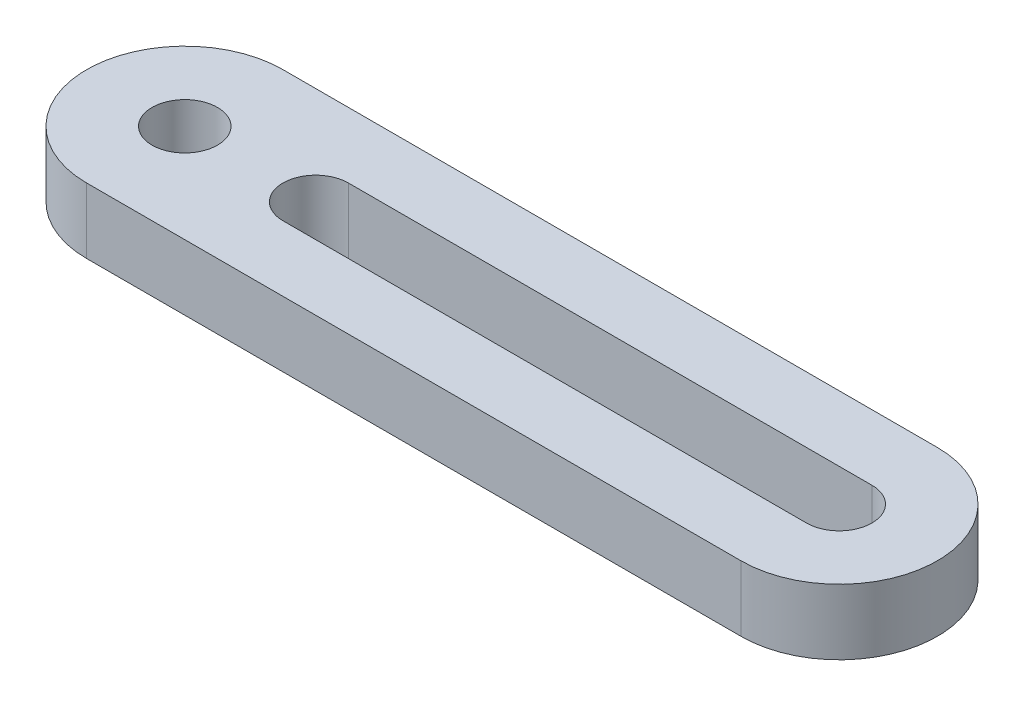
ISO-10303-21;
HEADER;
FILE_DESCRIPTION(('STEP AP214'),'2;1');
FILE_NAME('part.step','',(''),(''),'','','');
FILE_SCHEMA(('AUTOMOTIVE_DESIGN { 1 0 10303 214 1 1 1 1 }'));
ENDSEC;
DATA;
#1=APPLICATION_CONTEXT('core data for automotive mechanical design processes');
#2=APPLICATION_PROTOCOL_DEFINITION('international standard','automotive_design',2000,#1);
#3=PRODUCT_CONTEXT('',#1,'mechanical');
#4=PRODUCT('Part','Part','',(#3));
#5=PRODUCT_RELATED_PRODUCT_CATEGORY('part','',(#4));
#6=PRODUCT_DEFINITION_FORMATION('','',#4);
#7=PRODUCT_DEFINITION_CONTEXT('part definition',#1,'design');
#8=PRODUCT_DEFINITION('design','',#6,#7);
#9=PRODUCT_DEFINITION_SHAPE('','',#8);
#10=(LENGTH_UNIT() NAMED_UNIT(*) SI_UNIT(.MILLI.,.METRE.));
#11=(NAMED_UNIT(*) PLANE_ANGLE_UNIT() SI_UNIT($,.RADIAN.));
#12=(NAMED_UNIT(*) SI_UNIT($,.STERADIAN.) SOLID_ANGLE_UNIT());
#13=UNCERTAINTY_MEASURE_WITH_UNIT(LENGTH_MEASURE(1.E-05),#10,'distance_accuracy_value','');
#14=(GEOMETRIC_REPRESENTATION_CONTEXT(3) GLOBAL_UNCERTAINTY_ASSIGNED_CONTEXT((#13)) GLOBAL_UNIT_ASSIGNED_CONTEXT((#10,
#11,#12)) REPRESENTATION_CONTEXT('',''));
#15=CARTESIAN_POINT('',(0.,0.,0.));
#16=DIRECTION('',(0.,0.,1.));
#17=DIRECTION('',(1.,0.,0.));
#18=AXIS2_PLACEMENT_3D('',#15,#16,#17);
#19=CARTESIAN_POINT('',(-39.4188177756188,5.,-7.12187860459529));
#20=DIRECTION('',(0.,-1.,0.));
#21=DIRECTION('',(0.,0.,-1.));
#22=AXIS2_PLACEMENT_3D('',#19,#20,#21);
#23=CYLINDRICAL_SURFACE('',#22,7.5);
#24=CARTESIAN_POINT('',(-39.4188177756188,0.,-7.12187860459529));
#25=DIRECTION('',(0.,1.,0.));
#26=DIRECTION('',(0.,0.,1.));
#27=AXIS2_PLACEMENT_3D('',#24,#25,#26);
#28=CIRCLE('',#27,7.5);
#29=CARTESIAN_POINT('',(-39.4188177756188,0.,-14.6218786045953));
#30=VERTEX_POINT('',#29);
#31=CARTESIAN_POINT('',(-39.4188177756188,0.,0.378121395404711));
#32=VERTEX_POINT('',#31);
#33=EDGE_CURVE('E131',#30,#32,#28,.T.);
#34=ORIENTED_EDGE('',*,*,#33,.T.);
#35=DIRECTION('',(0.,-1.,0.));
#36=VECTOR('',#35,1.);
#37=CARTESIAN_POINT('',(-39.4188177756188,5.,0.378121395404711));
#38=LINE('',#37,#36);
#39=CARTESIAN_POINT('',(-39.4188177756188,5.,0.378121395404711));
#40=VERTEX_POINT('',#39);
#41=EDGE_CURVE('E11',#40,#32,#38,.T.);
#42=ORIENTED_EDGE('',*,*,#41,.F.);
#43=CARTESIAN_POINT('',(-39.4188177756188,5.,-7.12187860459529));
#44=DIRECTION('',(0.,1.,0.));
#45=DIRECTION('',(0.,0.,1.));
#46=AXIS2_PLACEMENT_3D('',#43,#44,#45);
#47=CIRCLE('',#46,7.5);
#48=CARTESIAN_POINT('',(-39.4188177756188,5.,-14.6218786045953));
#49=VERTEX_POINT('',#48);
#50=EDGE_CURVE('E140',#49,#40,#47,.T.);
#51=ORIENTED_EDGE('',*,*,#50,.F.);
#52=DIRECTION('',(0.,-1.,0.));
#53=VECTOR('',#52,1.);
#54=CARTESIAN_POINT('',(-39.4188177756188,5.,-14.6218786045953));
#55=LINE('',#54,#53);
#56=EDGE_CURVE('E150',#49,#30,#55,.T.);
#57=ORIENTED_EDGE('',*,*,#56,.T.);
#58=EDGE_LOOP('',(#34,#42,#51,#57));
#59=FACE_BOUND('',#58,.T.);
#60=ADVANCED_FACE('F33',(#59),#23,.T.);
#61=CARTESIAN_POINT('',(-39.4188177756188,5.,0.378121395404711));
#62=DIRECTION('',(0.,0.,-1.));
#63=DIRECTION('',(-1.,0.,0.));
#64=AXIS2_PLACEMENT_3D('',#61,#62,#63);
#65=PLANE('',#64);
#66=DIRECTION('',(1.,0.,0.));
#67=VECTOR('',#66,1.);
#68=CARTESIAN_POINT('',(-39.4188177756188,0.,0.378121395404711));
#69=LINE('',#68,#67);
#70=CARTESIAN_POINT('',(10.5811822243812,0.,0.37812139540471));
#71=VERTEX_POINT('',#70);
#72=EDGE_CURVE('E153',#32,#71,#69,.T.);
#73=ORIENTED_EDGE('',*,*,#72,.T.);
#74=DIRECTION('',(0.,-1.,0.));
#75=VECTOR('',#74,1.);
#76=CARTESIAN_POINT('',(10.5811822243812,5.,0.37812139540471));
#77=LINE('',#76,#75);
#78=CARTESIAN_POINT('',(10.5811822243812,5.,0.37812139540471));
#79=VERTEX_POINT('',#78);
#80=EDGE_CURVE('E40',#79,#71,#77,.T.);
#81=ORIENTED_EDGE('',*,*,#80,.F.);
#82=DIRECTION('',(1.,0.,0.));
#83=VECTOR('',#82,1.);
#84=CARTESIAN_POINT('',(-39.4188177756188,5.,0.378121395404711));
#85=LINE('',#84,#83);
#86=EDGE_CURVE('E143',#40,#79,#85,.T.);
#87=ORIENTED_EDGE('',*,*,#86,.F.);
#88=ORIENTED_EDGE('',*,*,#41,.T.);
#89=EDGE_LOOP('',(#73,#81,#87,#88));
#90=FACE_BOUND('',#89,.T.);
#91=ADVANCED_FACE('F182',(#90),#65,.F.);
#92=CARTESIAN_POINT('',(10.5811822243812,5.,-7.12187860459529));
#93=DIRECTION('',(0.,-1.,0.));
#94=DIRECTION('',(0.,0.,-1.));
#95=AXIS2_PLACEMENT_3D('',#92,#93,#94);
#96=CYLINDRICAL_SURFACE('',#95,7.5);
#97=CARTESIAN_POINT('',(10.5811822243812,0.,-7.12187860459529));
#98=DIRECTION('',(0.,1.,0.));
#99=DIRECTION('',(0.,0.,1.));
#100=AXIS2_PLACEMENT_3D('',#97,#98,#99);
#101=CIRCLE('',#100,7.5);
#102=CARTESIAN_POINT('',(10.5811822243812,0.,-14.6218786045953));
#103=VERTEX_POINT('',#102);
#104=EDGE_CURVE('E155',#71,#103,#101,.T.);
#105=ORIENTED_EDGE('',*,*,#104,.T.);
#106=DIRECTION('',(0.,-1.,0.));
#107=VECTOR('',#106,1.);
#108=CARTESIAN_POINT('',(10.5811822243812,5.,-14.6218786045953));
#109=LINE('',#108,#107);
#110=CARTESIAN_POINT('',(10.5811822243812,5.,-14.6218786045953));
#111=VERTEX_POINT('',#110);
#112=EDGE_CURVE('E160',#111,#103,#109,.T.);
#113=ORIENTED_EDGE('',*,*,#112,.F.);
#114=CARTESIAN_POINT('',(10.5811822243812,5.,-7.12187860459529));
#115=DIRECTION('',(0.,1.,0.));
#116=DIRECTION('',(0.,0.,1.));
#117=AXIS2_PLACEMENT_3D('',#114,#115,#116);
#118=CIRCLE('',#117,7.5);
#119=EDGE_CURVE('E146',#79,#111,#118,.T.);
#120=ORIENTED_EDGE('',*,*,#119,.F.);
#121=ORIENTED_EDGE('',*,*,#80,.T.);
#122=EDGE_LOOP('',(#105,#113,#120,#121));
#123=FACE_BOUND('',#122,.T.);
#124=ADVANCED_FACE('F167',(#123),#96,.T.);
#125=CARTESIAN_POINT('',(-39.4188177756188,5.,-14.6218786045953));
#126=DIRECTION('',(0.,0.,1.));
#127=DIRECTION('',(1.,0.,0.));
#128=AXIS2_PLACEMENT_3D('',#125,#126,#127);
#129=PLANE('',#128);
#130=DIRECTION('',(-1.,0.,0.));
#131=VECTOR('',#130,1.);
#132=CARTESIAN_POINT('',(-39.4188177756188,0.,-14.6218786045953));
#133=LINE('',#132,#131);
#134=EDGE_CURVE('E144',#103,#30,#133,.T.);
#135=ORIENTED_EDGE('',*,*,#134,.T.);
#136=ORIENTED_EDGE('',*,*,#56,.F.);
#137=DIRECTION('',(-1.,0.,0.));
#138=VECTOR('',#137,1.);
#139=CARTESIAN_POINT('',(-39.4188177756188,5.,-14.6218786045953));
#140=LINE('',#139,#138);
#141=EDGE_CURVE('E148',#111,#49,#140,.T.);
#142=ORIENTED_EDGE('',*,*,#141,.F.);
#143=ORIENTED_EDGE('',*,*,#112,.T.);
#144=EDGE_LOOP('',(#135,#136,#142,#143));
#145=FACE_BOUND('',#144,.T.);
#146=ADVANCED_FACE('F175',(#145),#129,.F.);
#147=CARTESIAN_POINT('',(-39.4188177756188,5.,-7.12187860459529));
#148=DIRECTION('',(0.,1.,0.));
#149=DIRECTION('',(0.,0.,1.));
#150=AXIS2_PLACEMENT_3D('',#147,#148,#149);
#151=PLANE('',#150);
#152=CARTESIAN_POINT('',(-29.4194903271945,5.,-7.12187860459529));
#153=DIRECTION('',(0.,1.,0.));
#154=DIRECTION('',(0.,0.,1.));
#155=AXIS2_PLACEMENT_3D('',#152,#153,#154);
#156=CIRCLE('',#155,2.5);
#157=CARTESIAN_POINT('',(-29.4194903271945,5.,-9.62187860459529));
#158=VERTEX_POINT('',#157);
#159=CARTESIAN_POINT('',(-29.4194903271945,5.,-4.62187860459529));
#160=VERTEX_POINT('',#159);
#161=EDGE_CURVE('E47',#158,#160,#156,.T.);
#162=ORIENTED_EDGE('',*,*,#161,.F.);
#163=DIRECTION('',(-1.,0.,0.));
#164=VECTOR('',#163,1.);
#165=CARTESIAN_POINT('',(-29.4194903271945,5.,-9.62187860459529));
#166=LINE('',#165,#164);
#167=CARTESIAN_POINT('',(10.5811822243812,5.,-9.62187860459529));
#168=VERTEX_POINT('',#167);
#169=EDGE_CURVE('E115',#168,#158,#166,.T.);
#170=ORIENTED_EDGE('',*,*,#169,.F.);
#171=CARTESIAN_POINT('',(10.5811822243812,5.,-7.12187860459529));
#172=DIRECTION('',(0.,1.,0.));
#173=DIRECTION('',(0.,0.,1.));
#174=AXIS2_PLACEMENT_3D('',#171,#172,#173);
#175=CIRCLE('',#174,2.5);
#176=CARTESIAN_POINT('',(10.5811822243812,5.,-4.62187860459529));
#177=VERTEX_POINT('',#176);
#178=EDGE_CURVE('E118',#177,#168,#175,.T.);
#179=ORIENTED_EDGE('',*,*,#178,.F.);
#180=DIRECTION('',(1.,0.,0.));
#181=VECTOR('',#180,1.);
#182=CARTESIAN_POINT('',(-29.4194903271945,5.,-4.62187860459529));
#183=LINE('',#182,#181);
#184=EDGE_CURVE('E124',#160,#177,#183,.T.);
#185=ORIENTED_EDGE('',*,*,#184,.F.);
#186=EDGE_LOOP('',(#162,#170,#179,#185));
#187=FACE_BOUND('',#186,.T.);
#188=CARTESIAN_POINT('',(-39.4188177756188,5.,-7.12187860459529));
#189=DIRECTION('',(0.,1.,0.));
#190=DIRECTION('',(0.,0.,1.));
#191=AXIS2_PLACEMENT_3D('',#188,#189,#190);
#192=CIRCLE('',#191,2.5);
#193=CARTESIAN_POINT('',(-39.4188177756188,5.,-4.62187860459529));
#194=VERTEX_POINT('',#193);
#195=EDGE_CURVE('E137',#194,#194,#192,.T.);
#196=ORIENTED_EDGE('',*,*,#195,.F.);
#197=EDGE_LOOP('',(#196));
#198=FACE_BOUND('',#197,.T.);
#199=ORIENTED_EDGE('',*,*,#50,.T.);
#200=ORIENTED_EDGE('',*,*,#86,.T.);
#201=ORIENTED_EDGE('',*,*,#119,.T.);
#202=ORIENTED_EDGE('',*,*,#141,.T.);
#203=EDGE_LOOP('',(#199,#200,#201,#202));
#204=FACE_BOUND('',#203,.T.);
#205=ADVANCED_FACE('F181',(#187,#198,#204),#151,.T.);
#206=CARTESIAN_POINT('',(-39.4188177756188,0.,-7.12187860459529));
#207=DIRECTION('',(0.,1.,0.));
#208=DIRECTION('',(0.,0.,1.));
#209=AXIS2_PLACEMENT_3D('',#206,#207,#208);
#210=PLANE('',#209);
#211=DIRECTION('',(-1.,0.,0.));
#212=VECTOR('',#211,1.);
#213=CARTESIAN_POINT('',(-29.4194903271945,0.,-9.62187860459529));
#214=LINE('',#213,#212);
#215=CARTESIAN_POINT('',(10.5811822243812,0.,-9.62187860459529));
#216=VERTEX_POINT('',#215);
#217=CARTESIAN_POINT('',(-29.4194903271945,0.,-9.62187860459529));
#218=VERTEX_POINT('',#217);
#219=EDGE_CURVE('E105',#216,#218,#214,.T.);
#220=ORIENTED_EDGE('',*,*,#219,.T.);
#221=CARTESIAN_POINT('',(-29.4194903271945,0.,-7.12187860459529));
#222=DIRECTION('',(0.,1.,0.));
#223=DIRECTION('',(0.,0.,1.));
#224=AXIS2_PLACEMENT_3D('',#221,#222,#223);
#225=CIRCLE('',#224,2.5);
#226=CARTESIAN_POINT('',(-29.4194903271945,0.,-4.62187860459529));
#227=VERTEX_POINT('',#226);
#228=EDGE_CURVE('E99',#218,#227,#225,.T.);
#229=ORIENTED_EDGE('',*,*,#228,.T.);
#230=DIRECTION('',(1.,0.,0.));
#231=VECTOR('',#230,1.);
#232=CARTESIAN_POINT('',(-29.4194903271945,0.,-4.62187860459529));
#233=LINE('',#232,#231);
#234=CARTESIAN_POINT('',(10.5811822243812,0.,-4.62187860459529));
#235=VERTEX_POINT('',#234);
#236=EDGE_CURVE('E108',#227,#235,#233,.T.);
#237=ORIENTED_EDGE('',*,*,#236,.T.);
#238=CARTESIAN_POINT('',(10.5811822243812,0.,-7.12187860459529));
#239=DIRECTION('',(0.,1.,0.));
#240=DIRECTION('',(0.,0.,1.));
#241=AXIS2_PLACEMENT_3D('',#238,#239,#240);
#242=CIRCLE('',#241,2.5);
#243=EDGE_CURVE('E55',#235,#216,#242,.T.);
#244=ORIENTED_EDGE('',*,*,#243,.T.);
#245=EDGE_LOOP('',(#220,#229,#237,#244));
#246=FACE_BOUND('',#245,.T.);
#247=CARTESIAN_POINT('',(-39.4188177756188,0.,-7.12187860459529));
#248=DIRECTION('',(0.,1.,0.));
#249=DIRECTION('',(0.,0.,1.));
#250=AXIS2_PLACEMENT_3D('',#247,#248,#249);
#251=CIRCLE('',#250,2.5);
#252=CARTESIAN_POINT('',(-39.4188177756188,0.,-4.62187860459529));
#253=VERTEX_POINT('',#252);
#254=EDGE_CURVE('E125',#253,#253,#251,.T.);
#255=ORIENTED_EDGE('',*,*,#254,.T.);
#256=EDGE_LOOP('',(#255));
#257=FACE_BOUND('',#256,.T.);
#258=ORIENTED_EDGE('',*,*,#33,.F.);
#259=ORIENTED_EDGE('',*,*,#134,.F.);
#260=ORIENTED_EDGE('',*,*,#104,.F.);
#261=ORIENTED_EDGE('',*,*,#72,.F.);
#262=EDGE_LOOP('',(#258,#259,#260,#261));
#263=FACE_BOUND('',#262,.T.);
#264=ADVANCED_FACE('F112',(#246,#257,#263),#210,.F.);
#265=CARTESIAN_POINT('',(-39.4188177756188,0.,-7.12187860459529));
#266=DIRECTION('',(0.,1.,0.));
#267=DIRECTION('',(0.,0.,1.));
#268=AXIS2_PLACEMENT_3D('',#265,#266,#267);
#269=CYLINDRICAL_SURFACE('',#268,2.5);
#270=ORIENTED_EDGE('',*,*,#254,.F.);
#271=EDGE_LOOP('',(#270));
#272=FACE_BOUND('',#271,.T.);
#273=ORIENTED_EDGE('',*,*,#195,.T.);
#274=EDGE_LOOP('',(#273));
#275=FACE_BOUND('',#274,.T.);
#276=ADVANCED_FACE('F194',(#272,#275),#269,.F.);
#277=CARTESIAN_POINT('',(-29.4194903271945,0.,-7.12187860459529));
#278=DIRECTION('',(0.,1.,0.));
#279=DIRECTION('',(0.,0.,1.));
#280=AXIS2_PLACEMENT_3D('',#277,#278,#279);
#281=CYLINDRICAL_SURFACE('',#280,2.5);
#282=ORIENTED_EDGE('',*,*,#161,.T.);
#283=DIRECTION('',(0.,1.,0.));
#284=VECTOR('',#283,1.);
#285=CARTESIAN_POINT('',(-29.4194903271945,0.,-4.62187860459529));
#286=LINE('',#285,#284);
#287=EDGE_CURVE('E95',#227,#160,#286,.T.);
#288=ORIENTED_EDGE('',*,*,#287,.F.);
#289=ORIENTED_EDGE('',*,*,#228,.F.);
#290=DIRECTION('',(0.,1.,0.));
#291=VECTOR('',#290,1.);
#292=CARTESIAN_POINT('',(-29.4194903271945,0.,-9.62187860459529));
#293=LINE('',#292,#291);
#294=EDGE_CURVE('E129',#218,#158,#293,.T.);
#295=ORIENTED_EDGE('',*,*,#294,.T.);
#296=EDGE_LOOP('',(#282,#288,#289,#295));
#297=FACE_BOUND('',#296,.T.);
#298=ADVANCED_FACE('F97',(#297),#281,.F.);
#299=CARTESIAN_POINT('',(-29.4194903271945,0.,-9.62187860459529));
#300=DIRECTION('',(0.,0.,-1.));
#301=DIRECTION('',(-1.,0.,0.));
#302=AXIS2_PLACEMENT_3D('',#299,#300,#301);
#303=PLANE('',#302);
#304=ORIENTED_EDGE('',*,*,#169,.T.);
#305=ORIENTED_EDGE('',*,*,#294,.F.);
#306=ORIENTED_EDGE('',*,*,#219,.F.);
#307=DIRECTION('',(0.,1.,0.));
#308=VECTOR('',#307,1.);
#309=CARTESIAN_POINT('',(10.5811822243812,0.,-9.62187860459529));
#310=LINE('',#309,#308);
#311=EDGE_CURVE('E132',#216,#168,#310,.T.);
#312=ORIENTED_EDGE('',*,*,#311,.T.);
#313=EDGE_LOOP('',(#304,#305,#306,#312));
#314=FACE_BOUND('',#313,.T.);
#315=ADVANCED_FACE('F203',(#314),#303,.F.);
#316=CARTESIAN_POINT('',(10.5811822243812,0.,-7.12187860459529));
#317=DIRECTION('',(0.,1.,0.));
#318=DIRECTION('',(0.,0.,1.));
#319=AXIS2_PLACEMENT_3D('',#316,#317,#318);
#320=CYLINDRICAL_SURFACE('',#319,2.5);
#321=ORIENTED_EDGE('',*,*,#178,.T.);
#322=ORIENTED_EDGE('',*,*,#311,.F.);
#323=ORIENTED_EDGE('',*,*,#243,.F.);
#324=DIRECTION('',(0.,1.,0.));
#325=VECTOR('',#324,1.);
#326=CARTESIAN_POINT('',(10.5811822243812,0.,-4.62187860459529));
#327=LINE('',#326,#325);
#328=EDGE_CURVE('E104',#235,#177,#327,.T.);
#329=ORIENTED_EDGE('',*,*,#328,.T.);
#330=EDGE_LOOP('',(#321,#322,#323,#329));
#331=FACE_BOUND('',#330,.T.);
#332=ADVANCED_FACE('F206',(#331),#320,.F.);
#333=CARTESIAN_POINT('',(-29.4194903271945,0.,-4.62187860459529));
#334=DIRECTION('',(0.,0.,1.));
#335=DIRECTION('',(1.,0.,0.));
#336=AXIS2_PLACEMENT_3D('',#333,#334,#335);
#337=PLANE('',#336);
#338=ORIENTED_EDGE('',*,*,#184,.T.);
#339=ORIENTED_EDGE('',*,*,#328,.F.);
#340=ORIENTED_EDGE('',*,*,#236,.F.);
#341=ORIENTED_EDGE('',*,*,#287,.T.);
#342=EDGE_LOOP('',(#338,#339,#340,#341));
#343=FACE_BOUND('',#342,.T.);
#344=ADVANCED_FACE('F109',(#343),#337,.F.);
#345=CLOSED_SHELL('',(#60,#91,#124,#146,#205,#264,#276,#298,#315,#332,#344));
#346=MANIFOLD_SOLID_BREP('B2',#345);
#347=ADVANCED_BREP_SHAPE_REPRESENTATION('',(#18,#346),#14);
#348=SHAPE_DEFINITION_REPRESENTATION(#9,#347);
ENDSEC;
END-ISO-10303-21;
